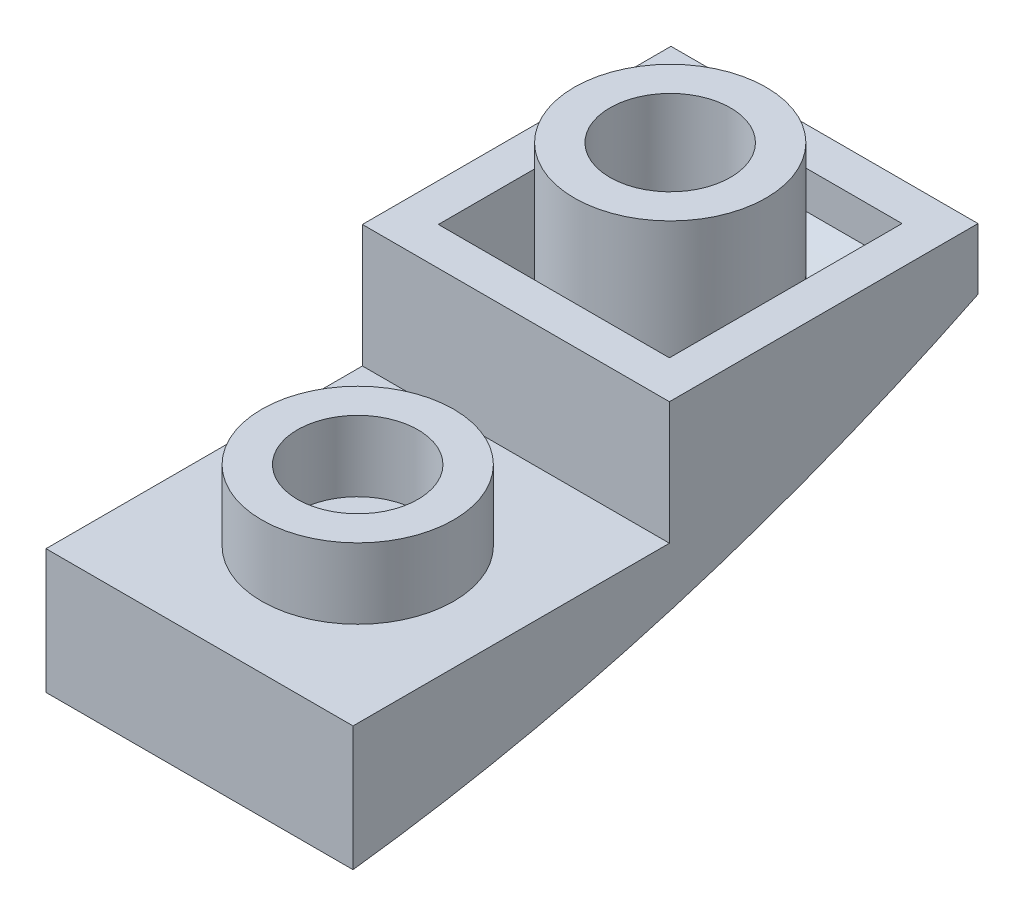
ISO-10303-21;
HEADER;
FILE_DESCRIPTION(('STEP AP214'),'2;1');
FILE_NAME('part.step','',(''),(''),'','','');
FILE_SCHEMA(('AUTOMOTIVE_DESIGN { 1 0 10303 214 1 1 1 1 }'));
ENDSEC;
DATA;
#1=APPLICATION_CONTEXT('core data for automotive mechanical design processes');
#2=APPLICATION_PROTOCOL_DEFINITION('international standard','automotive_design',2000,#1);
#3=PRODUCT_CONTEXT('',#1,'mechanical');
#4=PRODUCT('Part','Part','',(#3));
#5=PRODUCT_RELATED_PRODUCT_CATEGORY('part','',(#4));
#6=PRODUCT_DEFINITION_FORMATION('','',#4);
#7=PRODUCT_DEFINITION_CONTEXT('part definition',#1,'design');
#8=PRODUCT_DEFINITION('design','',#6,#7);
#9=PRODUCT_DEFINITION_SHAPE('','',#8);
#10=(LENGTH_UNIT() NAMED_UNIT(*) SI_UNIT(.MILLI.,.METRE.));
#11=(NAMED_UNIT(*) PLANE_ANGLE_UNIT() SI_UNIT($,.RADIAN.));
#12=(NAMED_UNIT(*) SI_UNIT($,.STERADIAN.) SOLID_ANGLE_UNIT());
#13=UNCERTAINTY_MEASURE_WITH_UNIT(LENGTH_MEASURE(1.E-05),#10,'distance_accuracy_value','');
#14=(GEOMETRIC_REPRESENTATION_CONTEXT(3) GLOBAL_UNCERTAINTY_ASSIGNED_CONTEXT((#13)) GLOBAL_UNIT_ASSIGNED_CONTEXT((#10,
#11,#12)) REPRESENTATION_CONTEXT('',''));
#15=CARTESIAN_POINT('',(0.,0.,0.));
#16=DIRECTION('',(0.,0.,1.));
#17=DIRECTION('',(1.,0.,0.));
#18=AXIS2_PLACEMENT_3D('',#15,#16,#17);
#19=CARTESIAN_POINT('',(-7.84,-43.320185519142,-22.0299823175645));
#20=DIRECTION('',(0.,1.,0.));
#21=DIRECTION('',(0.,0.,1.));
#22=AXIS2_PLACEMENT_3D('',#19,#20,#21);
#23=PLANE('',#22);
#24=DIRECTION('',(0.,0.,1.));
#25=VECTOR('',#24,1.);
#26=CARTESIAN_POINT('',(0.,-43.320185519142,-22.0299823175645));
#27=LINE('',#26,#25);
#28=CARTESIAN_POINT('',(0.,-43.320185519142,-22.0299823175645));
#29=VERTEX_POINT('',#28);
#30=CARTESIAN_POINT('',(0.,-43.320185519142,-14.1499823175645));
#31=VERTEX_POINT('',#30);
#32=EDGE_CURVE('E143',#29,#31,#27,.T.);
#33=ORIENTED_EDGE('',*,*,#32,.F.);
#34=DIRECTION('',(1.,0.,0.));
#35=VECTOR('',#34,1.);
#36=CARTESIAN_POINT('',(-7.84,-43.320185519142,-22.0299823175645));
#37=LINE('',#36,#35);
#38=CARTESIAN_POINT('',(-7.84,-43.320185519142,-22.0299823175645));
#39=VERTEX_POINT('',#38);
#40=EDGE_CURVE('E156',#39,#29,#37,.T.);
#41=ORIENTED_EDGE('',*,*,#40,.F.);
#42=DIRECTION('',(0.,0.,1.));
#43=VECTOR('',#42,1.);
#44=CARTESIAN_POINT('',(-7.84,-43.320185519142,-22.0299823175645));
#45=LINE('',#44,#43);
#46=CARTESIAN_POINT('',(-7.84,-43.320185519142,-14.1499823175645));
#47=VERTEX_POINT('',#46);
#48=EDGE_CURVE('E129',#39,#47,#45,.T.);
#49=ORIENTED_EDGE('',*,*,#48,.T.);
#50=DIRECTION('',(1.,0.,0.));
#51=VECTOR('',#50,1.);
#52=CARTESIAN_POINT('',(-7.84,-43.320185519142,-14.1499823175645));
#53=LINE('',#52,#51);
#54=EDGE_CURVE('E118',#47,#31,#53,.T.);
#55=ORIENTED_EDGE('',*,*,#54,.T.);
#56=EDGE_LOOP('',(#33,#41,#49,#55));
#57=FACE_BOUND('',#56,.T.);
#58=DIRECTION('',(1.,0.,0.));
#59=VECTOR('',#58,1.);
#60=CARTESIAN_POINT('',(-7.84,-43.320185519142,-21.0599823175645));
#61=LINE('',#60,#59);
#62=CARTESIAN_POINT('',(-6.87,-43.320185519142,-21.0599823175645));
#63=VERTEX_POINT('',#62);
#64=CARTESIAN_POINT('',(-0.97,-43.320185519142,-21.0599823175645));
#65=VERTEX_POINT('',#64);
#66=EDGE_CURVE('E207',#63,#65,#61,.T.);
#67=ORIENTED_EDGE('',*,*,#66,.T.);
#68=DIRECTION('',(0.,0.,1.));
#69=VECTOR('',#68,1.);
#70=CARTESIAN_POINT('',(-0.97,-43.320185519142,0.));
#71=LINE('',#70,#69);
#72=CARTESIAN_POINT('',(-0.97,-43.320185519142,-15.1199823175645));
#73=VERTEX_POINT('',#72);
#74=EDGE_CURVE('E227',#65,#73,#71,.T.);
#75=ORIENTED_EDGE('',*,*,#74,.T.);
#76=DIRECTION('',(1.,0.,0.));
#77=VECTOR('',#76,1.);
#78=CARTESIAN_POINT('',(-7.84,-43.320185519142,-15.1199823175645));
#79=LINE('',#78,#77);
#80=CARTESIAN_POINT('',(-6.87,-43.320185519142,-15.1199823175645));
#81=VERTEX_POINT('',#80);
#82=EDGE_CURVE('E215',#81,#73,#79,.T.);
#83=ORIENTED_EDGE('',*,*,#82,.F.);
#84=DIRECTION('',(0.,0.,1.));
#85=VECTOR('',#84,1.);
#86=CARTESIAN_POINT('',(-6.87,-43.320185519142,0.));
#87=LINE('',#86,#85);
#88=EDGE_CURVE('E51',#63,#81,#87,.T.);
#89=ORIENTED_EDGE('',*,*,#88,.F.);
#90=EDGE_LOOP('',(#67,#75,#83,#89));
#91=FACE_BOUND('',#90,.T.);
#92=ADVANCED_FACE('F36',(#57,#91),#23,.T.);
#93=CARTESIAN_POINT('',(-7.84,0.,0.));
#94=DIRECTION('',(1.,0.,0.));
#95=DIRECTION('',(0.,0.,-1.));
#96=AXIS2_PLACEMENT_3D('',#93,#94,#95);
#97=CYLINDRICAL_SURFACE('',#96,50.);
#98=CARTESIAN_POINT('',(0.,0.,0.));
#99=DIRECTION('',(1.,0.,0.));
#100=DIRECTION('',(0.,0.,-1.));
#101=AXIS2_PLACEMENT_3D('',#98,#99,#100);
#102=CIRCLE('',#101,50.);
#103=CARTESIAN_POINT('',(0.,-49.630185519142,-6.0699823175645));
#104=VERTEX_POINT('',#103);
#105=CARTESIAN_POINT('',(0.,-44.885185519142,-22.0299823175645));
#106=VERTEX_POINT('',#105);
#107=EDGE_CURVE('E136',#104,#106,#102,.T.);
#108=ORIENTED_EDGE('',*,*,#107,.F.);
#109=DIRECTION('',(1.,0.,0.));
#110=VECTOR('',#109,1.);
#111=CARTESIAN_POINT('',(-7.84,-49.630185519142,-6.0699823175645));
#112=LINE('',#111,#110);
#113=CARTESIAN_POINT('',(-7.84,-49.630185519142,-6.0699823175645));
#114=VERTEX_POINT('',#113);
#115=EDGE_CURVE('E60',#114,#104,#112,.T.);
#116=ORIENTED_EDGE('',*,*,#115,.F.);
#117=CARTESIAN_POINT('',(-7.84,0.,0.));
#118=DIRECTION('',(1.,0.,0.));
#119=DIRECTION('',(0.,0.,-1.));
#120=AXIS2_PLACEMENT_3D('',#117,#118,#119);
#121=CIRCLE('',#120,50.);
#122=CARTESIAN_POINT('',(-7.84,-44.885185519142,-22.0299823175645));
#123=VERTEX_POINT('',#122);
#124=EDGE_CURVE('E152',#114,#123,#121,.T.);
#125=ORIENTED_EDGE('',*,*,#124,.T.);
#126=DIRECTION('',(1.,0.,0.));
#127=VECTOR('',#126,1.);
#128=CARTESIAN_POINT('',(-7.84,-44.885185519142,-22.0299823175645));
#129=LINE('',#128,#127);
#130=EDGE_CURVE('E93',#123,#106,#129,.T.);
#131=ORIENTED_EDGE('',*,*,#130,.T.);
#132=EDGE_LOOP('',(#108,#116,#125,#131));
#133=FACE_BOUND('',#132,.T.);
#134=ADVANCED_FACE('F38',(#133),#97,.T.);
#135=CARTESIAN_POINT('',(-7.84,-46.450185519142,-6.0699823175645));
#136=DIRECTION('',(0.,0.,1.));
#137=DIRECTION('',(1.,0.,0.));
#138=AXIS2_PLACEMENT_3D('',#135,#136,#137);
#139=PLANE('',#138);
#140=DIRECTION('',(0.,-1.,0.));
#141=VECTOR('',#140,1.);
#142=CARTESIAN_POINT('',(0.,-46.450185519142,-6.0699823175645));
#143=LINE('',#142,#141);
#144=CARTESIAN_POINT('',(0.,-46.450185519142,-6.0699823175645));
#145=VERTEX_POINT('',#144);
#146=EDGE_CURVE('E149',#145,#104,#143,.T.);
#147=ORIENTED_EDGE('',*,*,#146,.F.);
#148=DIRECTION('',(1.,0.,0.));
#149=VECTOR('',#148,1.);
#150=CARTESIAN_POINT('',(-7.84,-46.450185519142,-6.0699823175645));
#151=LINE('',#150,#149);
#152=CARTESIAN_POINT('',(-7.84,-46.450185519142,-6.0699823175645));
#153=VERTEX_POINT('',#152);
#154=EDGE_CURVE('E117',#153,#145,#151,.T.);
#155=ORIENTED_EDGE('',*,*,#154,.F.);
#156=DIRECTION('',(0.,-1.,0.));
#157=VECTOR('',#156,1.);
#158=CARTESIAN_POINT('',(-7.84,-46.450185519142,-6.0699823175645));
#159=LINE('',#158,#157);
#160=EDGE_CURVE('E126',#153,#114,#159,.T.);
#161=ORIENTED_EDGE('',*,*,#160,.T.);
#162=ORIENTED_EDGE('',*,*,#115,.T.);
#163=EDGE_LOOP('',(#147,#155,#161,#162));
#164=FACE_BOUND('',#163,.T.);
#165=ADVANCED_FACE('F247',(#164),#139,.T.);
#166=CARTESIAN_POINT('',(-7.84,-46.450185519142,-14.1499823175645));
#167=DIRECTION('',(0.,1.,0.));
#168=DIRECTION('',(0.,0.,1.));
#169=AXIS2_PLACEMENT_3D('',#166,#167,#168);
#170=PLANE('',#169);
#171=CARTESIAN_POINT('',(-3.92,-46.450185519142,-10.1099823175645));
#172=DIRECTION('',(0.,1.,0.));
#173=DIRECTION('',(0.,0.,1.));
#174=AXIS2_PLACEMENT_3D('',#171,#172,#173);
#175=CIRCLE('',#174,2.45);
#176=CARTESIAN_POINT('',(-3.92,-46.450185519142,-7.6599823175645));
#177=VERTEX_POINT('',#176);
#178=EDGE_CURVE('E531',#177,#177,#175,.T.);
#179=ORIENTED_EDGE('',*,*,#178,.F.);
#180=EDGE_LOOP('',(#179));
#181=FACE_BOUND('',#180,.T.);
#182=DIRECTION('',(0.,0.,1.));
#183=VECTOR('',#182,1.);
#184=CARTESIAN_POINT('',(0.,-46.450185519142,-14.1499823175645));
#185=LINE('',#184,#183);
#186=CARTESIAN_POINT('',(0.,-46.450185519142,-14.1499823175645));
#187=VERTEX_POINT('',#186);
#188=EDGE_CURVE('E112',#187,#145,#185,.T.);
#189=ORIENTED_EDGE('',*,*,#188,.F.);
#190=DIRECTION('',(1.,0.,0.));
#191=VECTOR('',#190,1.);
#192=CARTESIAN_POINT('',(-7.84,-46.450185519142,-14.1499823175645));
#193=LINE('',#192,#191);
#194=CARTESIAN_POINT('',(-7.84,-46.450185519142,-14.1499823175645));
#195=VERTEX_POINT('',#194);
#196=EDGE_CURVE('E106',#195,#187,#193,.T.);
#197=ORIENTED_EDGE('',*,*,#196,.F.);
#198=DIRECTION('',(0.,0.,1.));
#199=VECTOR('',#198,1.);
#200=CARTESIAN_POINT('',(-7.84,-46.450185519142,-14.1499823175645));
#201=LINE('',#200,#199);
#202=EDGE_CURVE('E109',#195,#153,#201,.T.);
#203=ORIENTED_EDGE('',*,*,#202,.T.);
#204=ORIENTED_EDGE('',*,*,#154,.T.);
#205=EDGE_LOOP('',(#189,#197,#203,#204));
#206=FACE_BOUND('',#205,.T.);
#207=ADVANCED_FACE('F108',(#181,#206),#170,.T.);
#208=CARTESIAN_POINT('',(-7.84,-43.320185519142,-14.1499823175645));
#209=DIRECTION('',(0.,0.,1.));
#210=DIRECTION('',(1.,0.,0.));
#211=AXIS2_PLACEMENT_3D('',#208,#209,#210);
#212=PLANE('',#211);
#213=DIRECTION('',(0.,-1.,0.));
#214=VECTOR('',#213,1.);
#215=CARTESIAN_POINT('',(0.,-43.320185519142,-14.1499823175645));
#216=LINE('',#215,#214);
#217=EDGE_CURVE('E146',#31,#187,#216,.T.);
#218=ORIENTED_EDGE('',*,*,#217,.F.);
#219=ORIENTED_EDGE('',*,*,#54,.F.);
#220=DIRECTION('',(0.,-1.,0.));
#221=VECTOR('',#220,1.);
#222=CARTESIAN_POINT('',(-7.84,-43.320185519142,-14.1499823175645));
#223=LINE('',#222,#221);
#224=EDGE_CURVE('E124',#47,#195,#223,.T.);
#225=ORIENTED_EDGE('',*,*,#224,.T.);
#226=ORIENTED_EDGE('',*,*,#196,.T.);
#227=EDGE_LOOP('',(#218,#219,#225,#226));
#228=FACE_BOUND('',#227,.T.);
#229=ADVANCED_FACE('F128',(#228),#212,.T.);
#230=CARTESIAN_POINT('',(-7.84,-44.885185519142,-22.0299823175645));
#231=DIRECTION('',(0.,0.,-1.));
#232=DIRECTION('',(-1.,0.,0.));
#233=AXIS2_PLACEMENT_3D('',#230,#231,#232);
#234=PLANE('',#233);
#235=DIRECTION('',(0.,1.,0.));
#236=VECTOR('',#235,1.);
#237=CARTESIAN_POINT('',(0.,-44.885185519142,-22.0299823175645));
#238=LINE('',#237,#236);
#239=EDGE_CURVE('E139',#106,#29,#238,.T.);
#240=ORIENTED_EDGE('',*,*,#239,.F.);
#241=ORIENTED_EDGE('',*,*,#130,.F.);
#242=DIRECTION('',(0.,1.,0.));
#243=VECTOR('',#242,1.);
#244=CARTESIAN_POINT('',(-7.84,-44.885185519142,-22.0299823175645));
#245=LINE('',#244,#243);
#246=EDGE_CURVE('E131',#123,#39,#245,.T.);
#247=ORIENTED_EDGE('',*,*,#246,.T.);
#248=ORIENTED_EDGE('',*,*,#40,.T.);
#249=EDGE_LOOP('',(#240,#241,#247,#248));
#250=FACE_BOUND('',#249,.T.);
#251=ADVANCED_FACE('F243',(#250),#234,.T.);
#252=CARTESIAN_POINT('',(-7.84,0.,0.));
#253=DIRECTION('',(1.,0.,0.));
#254=DIRECTION('',(0.,0.,-1.));
#255=AXIS2_PLACEMENT_3D('',#252,#253,#254);
#256=PLANE('',#255);
#257=ORIENTED_EDGE('',*,*,#124,.F.);
#258=ORIENTED_EDGE('',*,*,#160,.F.);
#259=ORIENTED_EDGE('',*,*,#202,.F.);
#260=ORIENTED_EDGE('',*,*,#224,.F.);
#261=ORIENTED_EDGE('',*,*,#48,.F.);
#262=ORIENTED_EDGE('',*,*,#246,.F.);
#263=EDGE_LOOP('',(#257,#258,#259,#260,#261,#262));
#264=FACE_BOUND('',#263,.T.);
#265=ADVANCED_FACE('F122',(#264),#256,.F.);
#266=CARTESIAN_POINT('',(0.,0.,0.));
#267=DIRECTION('',(1.,0.,0.));
#268=DIRECTION('',(0.,0.,-1.));
#269=AXIS2_PLACEMENT_3D('',#266,#267,#268);
#270=PLANE('',#269);
#271=ORIENTED_EDGE('',*,*,#107,.T.);
#272=ORIENTED_EDGE('',*,*,#239,.T.);
#273=ORIENTED_EDGE('',*,*,#32,.T.);
#274=ORIENTED_EDGE('',*,*,#217,.T.);
#275=ORIENTED_EDGE('',*,*,#188,.T.);
#276=ORIENTED_EDGE('',*,*,#146,.T.);
#277=EDGE_LOOP('',(#271,#272,#273,#274,#275,#276));
#278=FACE_BOUND('',#277,.T.);
#279=ADVANCED_FACE('F246',(#278),#270,.T.);
#280=CARTESIAN_POINT('',(-0.97,0.,0.));
#281=DIRECTION('',(1.,0.,0.));
#282=DIRECTION('',(0.,0.,-1.));
#283=AXIS2_PLACEMENT_3D('',#280,#281,#282);
#284=PLANE('',#283);
#285=DIRECTION('',(0.,-1.,0.));
#286=VECTOR('',#285,1.);
#287=CARTESIAN_POINT('',(-0.97,0.,-15.1199823175645));
#288=LINE('',#287,#286);
#289=CARTESIAN_POINT('',(-0.97,-46.6404013138452,-15.1199823175645));
#290=VERTEX_POINT('',#289);
#291=EDGE_CURVE('E221',#73,#290,#288,.T.);
#292=ORIENTED_EDGE('',*,*,#291,.F.);
#293=ORIENTED_EDGE('',*,*,#74,.F.);
#294=DIRECTION('',(0.,1.,0.));
#295=VECTOR('',#294,1.);
#296=CARTESIAN_POINT('',(-0.97,0.,-21.0599823175645));
#297=LINE('',#296,#295);
#298=CARTESIAN_POINT('',(-0.97,-44.2766083252079,-21.0599823175645));
#299=VERTEX_POINT('',#298);
#300=EDGE_CURVE('E192',#299,#65,#297,.T.);
#301=ORIENTED_EDGE('',*,*,#300,.F.);
#302=CARTESIAN_POINT('',(-0.97,0.,0.));
#303=DIRECTION('',(1.,0.,0.));
#304=DIRECTION('',(0.,0.,-1.));
#305=AXIS2_PLACEMENT_3D('',#302,#303,#304);
#306=CIRCLE('',#305,49.03);
#307=EDGE_CURVE('E193',#290,#299,#306,.T.);
#308=ORIENTED_EDGE('',*,*,#307,.F.);
#309=EDGE_LOOP('',(#292,#293,#301,#308));
#310=FACE_BOUND('',#309,.T.);
#311=ADVANCED_FACE('F336',(#310),#284,.F.);
#312=CARTESIAN_POINT('',(-7.84,0.,0.));
#313=DIRECTION('',(1.,0.,0.));
#314=DIRECTION('',(0.,0.,-1.));
#315=AXIS2_PLACEMENT_3D('',#312,#313,#314);
#316=CYLINDRICAL_SURFACE('',#315,49.03);
#317=CARTESIAN_POINT('',(-3.92,-46.4686114824434,-15.6399823175645));
#318=CARTESIAN_POINT('',(-3.78793012184935,-46.4686097458206,-15.6399890439709));
#319=CARTESIAN_POINT('',(-3.65575647217031,-46.4650061011459,-15.65070710071));
#320=CARTESIAN_POINT('',(-3.39513144873376,-46.4506659567495,-15.6932155357453));
#321=CARTESIAN_POINT('',(-3.26668505116116,-46.4399203414416,-15.7250328437522));
#322=CARTESIAN_POINT('',(-3.01742799039696,-46.411569374732,-15.8085121128509));
#323=CARTESIAN_POINT('',(-2.89660648318951,-46.3939740326378,-15.8601451162884));
#324=CARTESIAN_POINT('',(-2.66563665333225,-46.3523421335326,-15.981406944121));
#325=CARTESIAN_POINT('',(-2.55548629364526,-46.3283068091749,-16.0510323245711));
#326=CARTESIAN_POINT('',(-2.34642737949569,-46.2738038074009,-16.2074969528653));
#327=CARTESIAN_POINT('',(-2.24778498952123,-46.2432180540684,-16.2946501037191));
#328=CARTESIAN_POINT('',(-2.06650956523098,-46.1766092633735,-16.4824626218562));
#329=CARTESIAN_POINT('',(-1.98388009245983,-46.1405850195611,-16.5831249854108));
#330=CARTESIAN_POINT('',(-1.8325288872738,-46.0619747275058,-16.8002781505073));
#331=CARTESIAN_POINT('',(-1.76470341506555,-46.0191514136788,-16.9173072283813));
#332=CARTESIAN_POINT('',(-1.64957308803988,-45.9293665497608,-17.1595712133401));
#333=CARTESIAN_POINT('',(-1.60227386942889,-45.8824038673137,-17.2848083633886));
#334=CARTESIAN_POINT('',(-1.52660253365797,-45.7824926585864,-17.5477971657542));
#335=CARTESIAN_POINT('',(-1.49952651227691,-45.7293541945631,-17.685849817443));
#336=CARTESIAN_POINT('',(-1.46926439676582,-45.6209167200115,-17.9637168537708));
#337=CARTESIAN_POINT('',(-1.46608503600493,-45.5656171049467,-18.1035317238355));
#338=CARTESIAN_POINT('',(-1.48384426766833,-45.4514718745921,-18.3882915650631));
#339=CARTESIAN_POINT('',(-1.50598812203153,-45.3925865181727,-18.5331465964097));
#340=CARTESIAN_POINT('',(-1.57578298597003,-45.2756676834164,-18.8169709408147));
#341=CARTESIAN_POINT('',(-1.62343916496053,-45.2176343801754,-18.9559390548805));
#342=CARTESIAN_POINT('',(-1.74414181423609,-45.1035222138011,-19.225892690886));
#343=CARTESIAN_POINT('',(-1.81752207548778,-45.0474802694379,-19.3567452633338));
#344=CARTESIAN_POINT('',(-1.98812079840642,-44.9403345308019,-19.604219656365));
#345=CARTESIAN_POINT('',(-2.08533597266702,-44.8892300568875,-19.7208434361211));
#346=CARTESIAN_POINT('',(-2.29688751184831,-44.7963111178827,-19.9309828267208));
#347=CARTESIAN_POINT('',(-2.41032344350158,-44.7541946836954,-20.0252684191505));
#348=CARTESIAN_POINT('',(-2.65431371384398,-44.678796022317,-20.1929335965037));
#349=CARTESIAN_POINT('',(-2.78485677307532,-44.6455080175186,-20.2663268563578));
#350=CARTESIAN_POINT('',(-3.0472075034513,-44.5921919651223,-20.3833537210891));
#351=CARTESIAN_POINT('',(-3.17792899033321,-44.5712659879681,-20.4290124176829));
#352=CARTESIAN_POINT('',(-3.44635443299553,-44.5396996699489,-20.4977441070739));
#353=CARTESIAN_POINT('',(-3.58405413962597,-44.5290531471149,-20.520830674647));
#354=CARTESIAN_POINT('',(-3.85071360352618,-44.5191242327898,-20.5423609743118));
#355=CARTESIAN_POINT('',(-3.97949946032329,-44.5190068375307,-20.5426153922119));
#356=CARTESIAN_POINT('',(-4.23518179747117,-44.528051367823,-20.5230031354696));
#357=CARTESIAN_POINT('',(-4.36207858446745,-44.537211770305,-20.5031397634203));
#358=CARTESIAN_POINT('',(-4.60763085817048,-44.5640133151155,-20.4448185449616));
#359=CARTESIAN_POINT('',(-4.72640495132205,-44.5814676429411,-20.4067701967546));
#360=CARTESIAN_POINT('',(-4.95567129225842,-44.6239237057538,-20.3137621468375));
#361=CARTESIAN_POINT('',(-5.06616230589592,-44.648926562664,-20.258799931229));
#362=CARTESIAN_POINT('',(-5.28112812320348,-44.7066546195617,-20.1310963201581));
#363=CARTESIAN_POINT('',(-5.38511860862608,-44.7396731866612,-20.0576743841186));
#364=CARTESIAN_POINT('',(-5.57940231464429,-44.8114232025114,-19.896858969392));
#365=CARTESIAN_POINT('',(-5.66969100963508,-44.8501565305124,-19.809460893975));
#366=CARTESIAN_POINT('',(-5.84187390203068,-44.9353634360945,-19.6154559738905));
#367=CARTESIAN_POINT('',(-5.92246908391154,-44.9822114835006,-19.5078609280737));
#368=CARTESIAN_POINT('',(-6.06453453693933,-45.0794249936196,-19.2821537028778));
#369=CARTESIAN_POINT('',(-6.12599763781096,-45.1297917664337,-19.1640376017214));
#370=CARTESIAN_POINT('',(-6.23292344911244,-45.2366411847016,-18.9105142696247));
#371=CARTESIAN_POINT('',(-6.27673223388323,-45.2932921906905,-18.7744785450884));
#372=CARTESIAN_POINT('',(-6.34012024751547,-45.4072646047417,-18.4971272293612));
#373=CARTESIAN_POINT('',(-6.35969272567961,-45.4645861951003,-18.3558101784143));
#374=CARTESIAN_POINT('',(-6.37434942613532,-45.5806293594625,-18.0657817798217));
#375=CARTESIAN_POINT('',(-6.36841233708546,-45.6393139297917,-17.9170023608619));
#376=CARTESIAN_POINT('',(-6.32947939642826,-45.7540445572368,-17.6219568875695));
#377=CARTESIAN_POINT('',(-6.2964833042573,-45.8100905908905,-17.4756908555935));
#378=CARTESIAN_POINT('',(-6.20432585986975,-45.917289645555,-17.1920364770989));
#379=CARTESIAN_POINT('',(-6.14550273672492,-45.9684958462904,-17.0545588589998));
#380=CARTESIAN_POINT('',(-6.00276827178843,-46.0653692790056,-16.7911390966786));
#381=CARTESIAN_POINT('',(-5.91886517609546,-46.1110383246321,-16.6651931786763));
#382=CARTESIAN_POINT('',(-5.73289554596071,-46.1933115908786,-16.4357225901275));
#383=CARTESIAN_POINT('',(-5.63200446459476,-46.2302643467502,-16.3313711613554));
#384=CARTESIAN_POINT('',(-5.41194785196163,-46.2970021718265,-16.1412103590789));
#385=CARTESIAN_POINT('',(-5.29278446920477,-46.3267880826732,-16.0553988084559));
#386=CARTESIAN_POINT('',(-5.04756702014449,-46.3767431932261,-15.910503484547));
#387=CARTESIAN_POINT('',(-4.92238879612431,-46.3973915382596,-15.8500994939691));
#388=CARTESIAN_POINT('',(-4.66283700608917,-46.431060767675,-15.75119862291));
#389=CARTESIAN_POINT('',(-4.52847935175193,-46.4440944945141,-15.7126648602803));
#390=CARTESIAN_POINT('',(-4.31414990458189,-46.4582981071643,-15.6705988425715));
#391=CARTESIAN_POINT('',(-4.23582304262373,-46.4621613875718,-15.6591355012686));
#392=CARTESIAN_POINT('',(-4.07834321170273,-46.4673185684873,-15.6438253032962));
#393=CARTESIAN_POINT('',(-3.99919026037679,-46.4686125237377,-15.6399782843521));
#394=CARTESIAN_POINT('',(-3.92,-46.4686114824434,-15.6399823175645));
#395=B_SPLINE_CURVE_WITH_KNOTS('',3,(#317,#318,#319,#320,#321,#322,#323,#324,#325,#326,#327,
#328,#329,#330,#331,#332,#333,#334,#335,#336,#337,#338,#339,#340,#341,#342,#343,#344,#345,#346,
#347,#348,#349,#350,#351,#352,#353,#354,#355,#356,#357,#358,#359,#360,#361,#362,#363,#364,#365,
#366,#367,#368,#369,#370,#371,#372,#373,#374,#375,#376,#377,#378,#379,#380,#381,#382,#383,#384,
#385,#386,#387,#388,#389,#390,#391,#392,#393,#394),.UNSPECIFIED.,.T.,.F.,(4,2,2,2,2,2,2,2,2,2,2,
2,2,2,2,2,2,2,2,2,2,2,2,2,2,2,2,2,2,2,2,2,2,2,2,2,2,2,4),(0.,0.395912322200955,
0.792330936202807,1.18817243650357,1.58393822430024,1.98755015085772,2.39125174478852,
2.81503451962393,3.23893358544303,3.68809748665836,4.1373879441763,4.6089850853992,
5.08067781981912,5.55873267974914,6.03672164149962,6.49444904933009,6.95187616234211,
7.3697350719325,7.78734252821314,8.1718001006179,8.5561945696124,8.93231398057894,
9.30848932098079,9.70135212992641,10.0943444175838,10.5196224297355,10.9450596351904,
11.4042106215775,11.8634894695518,12.3413238945166,12.819162567636,13.290921925193,
13.7625263422607,14.2095358005104,14.6564927383364,15.0759336339128,15.4946650626455,
15.73206263082,15.9694551409101),.UNSPECIFIED.);
#396=CARTESIAN_POINT('',(-3.92,-46.4686114824434,-15.6399823175645));
#397=VERTEX_POINT('',#396);
#398=EDGE_CURVE('E179',#397,#397,#395,.T.);
#399=ORIENTED_EDGE('',*,*,#398,.F.);
#400=EDGE_LOOP('',(#399));
#401=FACE_BOUND('',#400,.T.);
#402=ORIENTED_EDGE('',*,*,#307,.T.);
#403=DIRECTION('',(1.,0.,0.));
#404=VECTOR('',#403,1.);
#405=CARTESIAN_POINT('',(-6.87,-44.2766083252079,-21.0599823175645));
#406=LINE('',#405,#404);
#407=CARTESIAN_POINT('',(-6.87,-44.2766083252079,-21.0599823175645));
#408=VERTEX_POINT('',#407);
#409=EDGE_CURVE('E204',#408,#299,#406,.T.);
#410=ORIENTED_EDGE('',*,*,#409,.F.);
#411=CARTESIAN_POINT('',(-6.87,0.,0.));
#412=DIRECTION('',(1.,0.,0.));
#413=DIRECTION('',(0.,0.,-1.));
#414=AXIS2_PLACEMENT_3D('',#411,#412,#413);
#415=CIRCLE('',#414,49.03);
#416=CARTESIAN_POINT('',(-6.87,-46.6404013138452,-15.1199823175645));
#417=VERTEX_POINT('',#416);
#418=EDGE_CURVE('E199',#417,#408,#415,.T.);
#419=ORIENTED_EDGE('',*,*,#418,.F.);
#420=DIRECTION('',(1.,0.,0.));
#421=VECTOR('',#420,1.);
#422=CARTESIAN_POINT('',(-7.84,-46.6404013138452,-15.1199823175645));
#423=LINE('',#422,#421);
#424=EDGE_CURVE('E197',#290,#417,#423,.F.);
#425=ORIENTED_EDGE('',*,*,#424,.F.);
#426=EDGE_LOOP('',(#402,#410,#419,#425));
#427=FACE_BOUND('',#426,.T.);
#428=ADVANCED_FACE('F164',(#401,#427),#316,.F.);
#429=CARTESIAN_POINT('',(-7.84,-43.320185519142,-15.1199823175645));
#430=DIRECTION('',(0.,0.,1.));
#431=DIRECTION('',(1.,0.,0.));
#432=AXIS2_PLACEMENT_3D('',#429,#430,#431);
#433=PLANE('',#432);
#434=ORIENTED_EDGE('',*,*,#424,.T.);
#435=DIRECTION('',(0.,-1.,0.));
#436=VECTOR('',#435,1.);
#437=CARTESIAN_POINT('',(-6.87,0.,-15.1199823175645));
#438=LINE('',#437,#436);
#439=EDGE_CURVE('E224',#81,#417,#438,.T.);
#440=ORIENTED_EDGE('',*,*,#439,.F.);
#441=ORIENTED_EDGE('',*,*,#82,.T.);
#442=ORIENTED_EDGE('',*,*,#291,.T.);
#443=EDGE_LOOP('',(#434,#440,#441,#442));
#444=FACE_BOUND('',#443,.T.);
#445=ADVANCED_FACE('F377',(#444),#433,.F.);
#446=CARTESIAN_POINT('',(-7.84,-44.885185519142,-21.0599823175645));
#447=DIRECTION('',(0.,0.,-1.));
#448=DIRECTION('',(-1.,0.,0.));
#449=AXIS2_PLACEMENT_3D('',#446,#447,#448);
#450=PLANE('',#449);
#451=ORIENTED_EDGE('',*,*,#300,.T.);
#452=ORIENTED_EDGE('',*,*,#66,.F.);
#453=DIRECTION('',(0.,1.,0.));
#454=VECTOR('',#453,1.);
#455=CARTESIAN_POINT('',(-6.87,0.,-21.0599823175645));
#456=LINE('',#455,#454);
#457=EDGE_CURVE('E202',#408,#63,#456,.T.);
#458=ORIENTED_EDGE('',*,*,#457,.F.);
#459=ORIENTED_EDGE('',*,*,#409,.T.);
#460=EDGE_LOOP('',(#451,#452,#458,#459));
#461=FACE_BOUND('',#460,.T.);
#462=ADVANCED_FACE('F457',(#461),#450,.F.);
#463=CARTESIAN_POINT('',(-6.87,0.,0.));
#464=DIRECTION('',(1.,0.,0.));
#465=DIRECTION('',(0.,0.,-1.));
#466=AXIS2_PLACEMENT_3D('',#463,#464,#465);
#467=PLANE('',#466);
#468=ORIENTED_EDGE('',*,*,#418,.T.);
#469=ORIENTED_EDGE('',*,*,#457,.T.);
#470=ORIENTED_EDGE('',*,*,#88,.T.);
#471=ORIENTED_EDGE('',*,*,#439,.T.);
#472=EDGE_LOOP('',(#468,#469,#470,#471));
#473=FACE_BOUND('',#472,.T.);
#474=ADVANCED_FACE('F362',(#473),#467,.T.);
#475=CARTESIAN_POINT('',(-3.92,-49.631185519142,-18.0899823175645));
#476=DIRECTION('',(0.,1.,0.));
#477=DIRECTION('',(0.,0.,1.));
#478=AXIS2_PLACEMENT_3D('',#475,#476,#477);
#479=CYLINDRICAL_SURFACE('',#478,2.45);
#480=CARTESIAN_POINT('',(-3.92,-41.520185519142,-18.0899823175645));
#481=DIRECTION('',(0.,1.,0.));
#482=DIRECTION('',(0.,0.,1.));
#483=AXIS2_PLACEMENT_3D('',#480,#481,#482);
#484=CIRCLE('',#483,2.45);
#485=CARTESIAN_POINT('',(-3.92,-41.520185519142,-15.6399823175645));
#486=VERTEX_POINT('',#485);
#487=EDGE_CURVE('E524',#486,#486,#484,.T.);
#488=ORIENTED_EDGE('',*,*,#487,.F.);
#489=EDGE_LOOP('',(#488));
#490=FACE_BOUND('',#489,.T.);
#491=ORIENTED_EDGE('',*,*,#398,.T.);
#492=EDGE_LOOP('',(#491));
#493=FACE_BOUND('',#492,.T.);
#494=ADVANCED_FACE('F173',(#490,#493),#479,.T.);
#495=CARTESIAN_POINT('',(-3.92,-49.631185519142,-18.0899823175645));
#496=DIRECTION('',(0.,1.,0.));
#497=DIRECTION('',(0.,0.,1.));
#498=AXIS2_PLACEMENT_3D('',#495,#496,#497);
#499=CYLINDRICAL_SURFACE('',#498,1.54);
#500=CARTESIAN_POINT('',(-3.92,-41.520185519142,-18.0899823175645));
#501=DIRECTION('',(0.,1.,0.));
#502=DIRECTION('',(0.,0.,1.));
#503=AXIS2_PLACEMENT_3D('',#500,#501,#502);
#504=CIRCLE('',#503,1.54);
#505=CARTESIAN_POINT('',(-3.92,-41.520185519142,-16.5499823175645));
#506=VERTEX_POINT('',#505);
#507=EDGE_CURVE('E186',#506,#506,#504,.T.);
#508=ORIENTED_EDGE('',*,*,#507,.T.);
#509=EDGE_LOOP('',(#508));
#510=FACE_BOUND('',#509,.T.);
#511=CARTESIAN_POINT('',(-3.92,-46.1523453931466,-16.5499823175645));
#512=CARTESIAN_POINT('',(-4.00265658618481,-46.1523440606546,-16.5499866181094));
#513=CARTESIAN_POINT('',(-4.08537938566165,-46.1499502249647,-16.5566663573778));
#514=CARTESIAN_POINT('',(-4.24848550067391,-46.1404399998,-16.5831506646262));
#515=CARTESIAN_POINT('',(-4.32886563090629,-46.1333174673482,-16.602972305002));
#516=CARTESIAN_POINT('',(-4.48482535924032,-46.1145775840233,-16.6549509406092));
#517=CARTESIAN_POINT('',(-4.56041261388604,-46.1029676236716,-16.6870876529241));
#518=CARTESIAN_POINT('',(-4.70492853381876,-46.0755915780129,-16.762528540768));
#519=CARTESIAN_POINT('',(-4.77385836275743,-46.0598262208308,-16.8058307598043));
#520=CARTESIAN_POINT('',(-4.90496423113328,-46.024155406278,-16.9032767443337));
#521=CARTESIAN_POINT('',(-4.96694640350392,-46.0041623572935,-16.9576487962539));
#522=CARTESIAN_POINT('',(-5.08093286238447,-45.9607960265032,-17.0748361184576));
#523=CARTESIAN_POINT('',(-5.13293469178494,-45.9374219147746,-17.1376534614721));
#524=CARTESIAN_POINT('',(-5.22860152252676,-45.8864747954225,-17.2736180547202));
#525=CARTESIAN_POINT('',(-5.27163854162327,-45.8587401699853,-17.3471463276676));
#526=CARTESIAN_POINT('',(-5.34479579603791,-45.800829930652,-17.4994720013529));
#527=CARTESIAN_POINT('',(-5.37491225181501,-45.7706536055707,-17.578270936091));
#528=CARTESIAN_POINT('',(-5.42328295311539,-45.7066409669505,-17.7440761670365));
#529=CARTESIAN_POINT('',(-5.44068563194482,-45.6726937337307,-17.8312883822246));
#530=CARTESIAN_POINT('',(-5.46030227898088,-45.6037094132006,-18.0069848541221));
#531=CARTESIAN_POINT('',(-5.46251207971466,-45.5686720295046,-18.0954694531825));
#532=CARTESIAN_POINT('',(-5.45156285268651,-45.4967815965628,-18.2754911342762));
#533=CARTESIAN_POINT('',(-5.43769408933485,-45.4599189939775,-18.3669820187234));
#534=CARTESIAN_POINT('',(-5.39372239890798,-45.3870376728844,-18.5463497784953));
#535=CARTESIAN_POINT('',(-5.36361693706224,-45.3510190870556,-18.6342260872295));
#536=CARTESIAN_POINT('',(-5.28750275739535,-45.2807606023153,-18.8043116868316));
#537=CARTESIAN_POINT('',(-5.24140153220838,-45.2465324126585,-18.8864846013767));
#538=CARTESIAN_POINT('',(-5.13422404148489,-45.1813425943839,-19.041908743309));
#539=CARTESIAN_POINT('',(-5.07315067860645,-45.1503803342603,-19.1151616958998));
#540=CARTESIAN_POINT('',(-4.94056961584797,-45.094393118175,-19.2468569516009));
#541=CARTESIAN_POINT('',(-4.86967797612682,-45.0691592522173,-19.3058289663151));
#542=CARTESIAN_POINT('',(-4.71732028985833,-45.0240721527784,-19.4107470058366));
#543=CARTESIAN_POINT('',(-4.63586060796653,-45.0042157027674,-19.4567008183119));
#544=CARTESIAN_POINT('',(-4.47184555938296,-44.9723278893222,-19.5302869243312));
#545=CARTESIAN_POINT('',(-4.38992205349121,-44.9597901986592,-19.5591083042566));
#546=CARTESIAN_POINT('',(-4.22173554439488,-44.9408340619904,-19.6026250279828));
#547=CARTESIAN_POINT('',(-4.13547483206766,-44.9344124205506,-19.6173277483506));
#548=CARTESIAN_POINT('',(-3.96766244520894,-44.9282738844848,-19.6313819244403));
#549=CARTESIAN_POINT('',(-3.88621021742351,-44.9281141338496,-19.6317473500454));
#550=CARTESIAN_POINT('',(-3.72445544750101,-44.9333906427946,-19.6196673927208));
#551=CARTESIAN_POINT('',(-3.6441527280452,-44.9388260296498,-19.6072240076987));
#552=CARTESIAN_POINT('',(-3.48852987361308,-44.9548640339716,-19.5704237928602));
#553=CARTESIAN_POINT('',(-3.41314369513393,-44.9653654915933,-19.5463001622697));
#554=CARTESIAN_POINT('',(-3.26762010390231,-44.991016967276,-19.4871836038792));
#555=CARTESIAN_POINT('',(-3.19748337131698,-45.0061675864332,-19.4521892705846));
#556=CARTESIAN_POINT('',(-3.06144218432985,-45.0411751066777,-19.3709955055796));
#557=CARTESIAN_POINT('',(-2.9958075491136,-45.0611918105086,-19.3244139802395));
#558=CARTESIAN_POINT('',(-2.87324236388512,-45.1048234946307,-19.2223535106108));
#559=CARTESIAN_POINT('',(-2.81631442680128,-45.1284395508788,-19.1668719055537));
#560=CARTESIAN_POINT('',(-2.70828311378424,-45.1803560981948,-19.0441873527648));
#561=CARTESIAN_POINT('',(-2.6579253937992,-45.2088741568547,-18.9764201312301));
#562=CARTESIAN_POINT('',(-2.56924762095053,-45.2682448461121,-18.8343526316358));
#563=CARTESIAN_POINT('',(-2.53093179780621,-45.2990982923039,-18.7600500697389));
#564=CARTESIAN_POINT('',(-2.46451095012547,-45.364657000922,-18.6009872987969));
#565=CARTESIAN_POINT('',(-2.43739397979127,-45.3994772670525,-18.515861020487));
#566=CARTESIAN_POINT('',(-2.39824023400188,-45.4698065856907,-18.3424738861913));
#567=CARTESIAN_POINT('',(-2.38620776331201,-45.505315831883,-18.2542121428028));
#568=CARTESIAN_POINT('',(-2.37730714379206,-45.5776355307723,-18.0729070359643));
#569=CARTESIAN_POINT('',(-2.38112962684763,-45.6144344786416,-17.9798241756351));
#570=CARTESIAN_POINT('',(-2.4055858033983,-45.6867174183395,-17.7953524456594));
#571=CARTESIAN_POINT('',(-2.42622053137577,-45.7222013291114,-17.7039636806071));
#572=CARTESIAN_POINT('',(-2.48391912645758,-45.790674624034,-17.5260964241757));
#573=CARTESIAN_POINT('',(-2.52089898206091,-45.8236757671003,-17.4395953424828));
#574=CARTESIAN_POINT('',(-2.6106323920816,-45.8864021527635,-17.2738776605832));
#575=CARTESIAN_POINT('',(-2.66338142898084,-45.9161283302315,-17.1946589826173));
#576=CARTESIAN_POINT('',(-2.78056846849896,-45.9700304714355,-17.0500111663051));
#577=CARTESIAN_POINT('',(-2.84432147636616,-45.9944047403279,-16.9841017693711));
#578=CARTESIAN_POINT('',(-2.98347397833901,-46.0385643887664,-16.8640324965265));
#579=CARTESIAN_POINT('',(-3.05887182995533,-46.0583504144951,-16.8098709661818));
#580=CARTESIAN_POINT('',(-3.21385391595365,-46.0915331697695,-16.7186626223481));
#581=CARTESIAN_POINT('',(-3.29284886940275,-46.1052612279379,-16.6807331867344));
#582=CARTESIAN_POINT('',(-3.45668405285945,-46.1276465171429,-16.618731207922));
#583=CARTESIAN_POINT('',(-3.54151363507552,-46.1363127249454,-16.5946341355067));
#584=CARTESIAN_POINT('',(-3.67591083006815,-46.1456446971195,-16.5686590289344));
#585=CARTESIAN_POINT('',(-3.72442202639997,-46.1481541583614,-16.5616663536));
#586=CARTESIAN_POINT('',(-3.82194772116938,-46.1515048824559,-16.5523267756446));
#587=CARTESIAN_POINT('',(-3.87096220800529,-46.1523461836761,-16.549979766174));
#588=CARTESIAN_POINT('',(-3.92,-46.1523453931466,-16.5499823175645));
#589=B_SPLINE_CURVE_WITH_KNOTS('',3,(#511,#512,#513,#514,#515,#516,#517,#518,#519,#520,#521,
#522,#523,#524,#525,#526,#527,#528,#529,#530,#531,#532,#533,#534,#535,#536,#537,#538,#539,#540,
#541,#542,#543,#544,#545,#546,#547,#548,#549,#550,#551,#552,#553,#554,#555,#556,#557,#558,#559,
#560,#561,#562,#563,#564,#565,#566,#567,#568,#569,#570,#571,#572,#573,#574,#575,#576,#577,#578,
#579,#580,#581,#582,#583,#584,#585,#586,#587,#588),.UNSPECIFIED.,.T.,.F.,(4,2,2,2,2,2,2,2,2,2,2,
2,2,2,2,2,2,2,2,2,2,2,2,2,2,2,2,2,2,2,2,2,2,2,2,2,2,2,4),(0.,0.247784646940981,
0.495891818609064,0.743592102074119,0.991249011345742,1.24465351075447,1.49812031725201,
1.76574620351611,2.03345032278392,2.31775796739206,2.6021435957189,2.89957614567731,
3.19705514236782,3.49628402531878,3.79545494238473,4.08073655560413,4.36584714730909,
4.62769174903446,4.88939947042233,5.13256251004731,5.37568762705105,5.61414721489411,
5.8526376464881,6.10038200351081,6.34820056471243,6.61440811017502,6.88070905686969,
7.16709456435762,7.45356178101729,7.75263544213349,8.05172750708552,8.34929984341937,
8.64678701348624,8.92995236736254,9.213077817566,9.47782826017606,9.7421077533182,
9.88911468904522,10.0361182435957),.UNSPECIFIED.);
#590=CARTESIAN_POINT('',(-3.92,-46.1523453931466,-16.5499823175645));
#591=VERTEX_POINT('',#590);
#592=EDGE_CURVE('E44',#591,#591,#589,.T.);
#593=ORIENTED_EDGE('',*,*,#592,.T.);
#594=EDGE_LOOP('',(#593));
#595=FACE_BOUND('',#594,.T.);
#596=ADVANCED_FACE('F168',(#510,#595),#499,.F.);
#597=CARTESIAN_POINT('',(-3.92,-41.520185519142,-18.0899823175645));
#598=DIRECTION('',(0.,1.,0.));
#599=DIRECTION('',(0.,0.,1.));
#600=AXIS2_PLACEMENT_3D('',#597,#598,#599);
#601=PLANE('',#600);
#602=ORIENTED_EDGE('',*,*,#507,.F.);
#603=EDGE_LOOP('',(#602));
#604=FACE_BOUND('',#603,.T.);
#605=ORIENTED_EDGE('',*,*,#487,.T.);
#606=EDGE_LOOP('',(#605));
#607=FACE_BOUND('',#606,.T.);
#608=ADVANCED_FACE('F172',(#604,#607),#601,.T.);
#609=ORIENTED_EDGE('',*,*,#592,.F.);
#610=EDGE_LOOP('',(#609));
#611=FACE_BOUND('',#610,.T.);
#612=ADVANCED_FACE('F285',(#611),#316,.F.);
#613=CARTESIAN_POINT('',(-3.92,-44.650185519142,-10.1099823175645));
#614=DIRECTION('',(0.,1.,0.));
#615=DIRECTION('',(0.,0.,1.));
#616=AXIS2_PLACEMENT_3D('',#613,#614,#615);
#617=PLANE('',#616);
#618=CARTESIAN_POINT('',(-3.92,-44.650185519142,-10.1099823175645));
#619=DIRECTION('',(0.,1.,0.));
#620=DIRECTION('',(0.,0.,1.));
#621=AXIS2_PLACEMENT_3D('',#618,#619,#620);
#622=CIRCLE('',#621,2.45);
#623=CARTESIAN_POINT('',(-3.92,-44.650185519142,-7.6599823175645));
#624=VERTEX_POINT('',#623);
#625=EDGE_CURVE('E187',#624,#624,#622,.T.);
#626=ORIENTED_EDGE('',*,*,#625,.T.);
#627=EDGE_LOOP('',(#626));
#628=FACE_BOUND('',#627,.T.);
#629=CARTESIAN_POINT('',(-3.92,-44.650185519142,-10.1099823175645));
#630=DIRECTION('',(0.,1.,0.));
#631=DIRECTION('',(0.,0.,1.));
#632=AXIS2_PLACEMENT_3D('',#629,#630,#631);
#633=CIRCLE('',#632,1.54);
#634=CARTESIAN_POINT('',(-3.92,-44.650185519142,-8.5699823175645));
#635=VERTEX_POINT('',#634);
#636=EDGE_CURVE('E534',#635,#635,#633,.T.);
#637=ORIENTED_EDGE('',*,*,#636,.F.);
#638=EDGE_LOOP('',(#637));
#639=FACE_BOUND('',#638,.T.);
#640=ADVANCED_FACE('F290',(#628,#639),#617,.T.);
#641=CARTESIAN_POINT('',(-3.92,-44.650185519142,-10.1099823175645));
#642=DIRECTION('',(0.,-1.,0.));
#643=DIRECTION('',(0.,0.,-1.));
#644=AXIS2_PLACEMENT_3D('',#641,#642,#643);
#645=CYLINDRICAL_SURFACE('',#644,2.45);
#646=ORIENTED_EDGE('',*,*,#625,.F.);
#647=EDGE_LOOP('',(#646));
#648=FACE_BOUND('',#647,.T.);
#649=ORIENTED_EDGE('',*,*,#178,.T.);
#650=EDGE_LOOP('',(#649));
#651=FACE_BOUND('',#650,.T.);
#652=ADVANCED_FACE('F295',(#648,#651),#645,.T.);
#653=CARTESIAN_POINT('',(-3.92,-44.650185519142,-10.1099823175645));
#654=DIRECTION('',(0.,-1.,0.));
#655=DIRECTION('',(0.,0.,-1.));
#656=AXIS2_PLACEMENT_3D('',#653,#654,#655);
#657=CYLINDRICAL_SURFACE('',#656,1.54);
#658=ORIENTED_EDGE('',*,*,#636,.T.);
#659=EDGE_LOOP('',(#658));
#660=FACE_BOUND('',#659,.T.);
#661=CARTESIAN_POINT('',(-3.92,-46.450185519142,-10.1099823175645));
#662=DIRECTION('',(0.,1.,0.));
#663=DIRECTION('',(0.,0.,1.));
#664=AXIS2_PLACEMENT_3D('',#661,#662,#663);
#665=CIRCLE('',#664,1.54);
#666=CARTESIAN_POINT('',(-3.92,-46.450185519142,-8.5699823175645));
#667=VERTEX_POINT('',#666);
#668=EDGE_CURVE('E11',#667,#667,#665,.F.);
#669=ORIENTED_EDGE('',*,*,#668,.T.);
#670=EDGE_LOOP('',(#669));
#671=FACE_BOUND('',#670,.T.);
#672=ADVANCED_FACE('F306',(#660,#671),#657,.F.);
#673=ORIENTED_EDGE('',*,*,#668,.F.);
#674=EDGE_LOOP('',(#673));
#675=FACE_BOUND('',#674,.T.);
#676=ADVANCED_FACE('F256',(#675),#170,.T.);
#677=CLOSED_SHELL('',(#92,#134,#165,#207,#229,#251,#265,#279,#311,#428,#445,#462,#474,#494,#596,
#608,#612,#640,#652,#672,#676));
#678=CARTESIAN_POINT('',(-0.97,-48.5219491464263,-7.0399823175645));
#679=VERTEX_POINT('',#678);
#680=CARTESIAN_POINT('',(-0.97,-47.420185519142,-12.4606141634413));
#681=VERTEX_POINT('',#680);
#682=EDGE_CURVE('E189',#679,#681,#306,.T.);
#683=ORIENTED_EDGE('',*,*,#682,.F.);
#684=DIRECTION('',(0.,-1.,0.));
#685=VECTOR('',#684,1.);
#686=CARTESIAN_POINT('',(-0.97,0.,-7.0399823175645));
#687=LINE('',#686,#685);
#688=CARTESIAN_POINT('',(-0.97,-47.420185519142,-7.0399823175645));
#689=VERTEX_POINT('',#688);
#690=EDGE_CURVE('E209',#689,#679,#687,.T.);
#691=ORIENTED_EDGE('',*,*,#690,.F.);
#692=DIRECTION('',(0.,0.,1.));
#693=VECTOR('',#692,1.);
#694=CARTESIAN_POINT('',(-0.97,-47.420185519142,0.));
#695=LINE('',#694,#693);
#696=EDGE_CURVE('E212',#681,#689,#695,.T.);
#697=ORIENTED_EDGE('',*,*,#696,.F.);
#698=EDGE_LOOP('',(#683,#691,#697));
#699=FACE_BOUND('',#698,.T.);
#700=ADVANCED_FACE('F329',(#699),#284,.F.);
#701=CARTESIAN_POINT('',(-7.84,-47.420185519142,-14.1499823175645));
#702=DIRECTION('',(0.,1.,0.));
#703=DIRECTION('',(0.,0.,1.));
#704=AXIS2_PLACEMENT_3D('',#701,#702,#703);
#705=PLANE('',#704);
#706=ORIENTED_EDGE('',*,*,#696,.T.);
#707=DIRECTION('',(1.,0.,0.));
#708=VECTOR('',#707,1.);
#709=CARTESIAN_POINT('',(-7.84,-47.420185519142,-7.0399823175645));
#710=LINE('',#709,#708);
#711=CARTESIAN_POINT('',(-6.87,-47.420185519142,-7.0399823175645));
#712=VERTEX_POINT('',#711);
#713=EDGE_CURVE('E198',#712,#689,#710,.T.);
#714=ORIENTED_EDGE('',*,*,#713,.F.);
#715=DIRECTION('',(0.,0.,1.));
#716=VECTOR('',#715,1.);
#717=CARTESIAN_POINT('',(-6.87,-47.420185519142,0.));
#718=LINE('',#717,#716);
#719=CARTESIAN_POINT('',(-6.87,-47.420185519142,-12.4606141634413));
#720=VERTEX_POINT('',#719);
#721=EDGE_CURVE('E218',#720,#712,#718,.T.);
#722=ORIENTED_EDGE('',*,*,#721,.F.);
#723=DIRECTION('',(1.,0.,0.));
#724=VECTOR('',#723,1.);
#725=CARTESIAN_POINT('',(-7.84,-47.420185519142,-12.4606141634413));
#726=LINE('',#725,#724);
#727=EDGE_CURVE('E140',#681,#720,#726,.F.);
#728=ORIENTED_EDGE('',*,*,#727,.F.);
#729=EDGE_LOOP('',(#706,#714,#722,#728));
#730=FACE_BOUND('',#729,.T.);
#731=ADVANCED_FACE('F333',(#730),#705,.F.);
#732=CARTESIAN_POINT('',(-7.84,-46.450185519142,-7.0399823175645));
#733=DIRECTION('',(0.,0.,1.));
#734=DIRECTION('',(1.,0.,0.));
#735=AXIS2_PLACEMENT_3D('',#732,#733,#734);
#736=PLANE('',#735);
#737=ORIENTED_EDGE('',*,*,#690,.T.);
#738=DIRECTION('',(1.,0.,0.));
#739=VECTOR('',#738,1.);
#740=CARTESIAN_POINT('',(-6.87,-48.5219491464263,-7.0399823175645));
#741=LINE('',#740,#739);
#742=CARTESIAN_POINT('',(-6.87,-48.5219491464263,-7.0399823175645));
#743=VERTEX_POINT('',#742);
#744=EDGE_CURVE('E194',#743,#679,#741,.T.);
#745=ORIENTED_EDGE('',*,*,#744,.F.);
#746=DIRECTION('',(0.,-1.,0.));
#747=VECTOR('',#746,1.);
#748=CARTESIAN_POINT('',(-6.87,0.,-7.0399823175645));
#749=LINE('',#748,#747);
#750=EDGE_CURVE('E208',#712,#743,#749,.T.);
#751=ORIENTED_EDGE('',*,*,#750,.F.);
#752=ORIENTED_EDGE('',*,*,#713,.T.);
#753=EDGE_LOOP('',(#737,#745,#751,#752));
#754=FACE_BOUND('',#753,.T.);
#755=ADVANCED_FACE('F344',(#754),#736,.F.);
#756=ORIENTED_EDGE('',*,*,#721,.T.);
#757=ORIENTED_EDGE('',*,*,#750,.T.);
#758=EDGE_CURVE('E203',#743,#720,#415,.T.);
#759=ORIENTED_EDGE('',*,*,#758,.T.);
#760=EDGE_LOOP('',(#756,#757,#759));
#761=FACE_BOUND('',#760,.T.);
#762=ADVANCED_FACE('F352',(#761),#467,.T.);
#763=ORIENTED_EDGE('',*,*,#727,.T.);
#764=ORIENTED_EDGE('',*,*,#758,.F.);
#765=ORIENTED_EDGE('',*,*,#744,.T.);
#766=ORIENTED_EDGE('',*,*,#682,.T.);
#767=EDGE_LOOP('',(#763,#764,#765,#766));
#768=FACE_BOUND('',#767,.T.);
#769=ADVANCED_FACE('F359',(#768),#316,.F.);
#770=CLOSED_SHELL('',(#700,#731,#755,#762,#769));
#771=ORIENTED_CLOSED_SHELL('',*,#770,.T.);
#772=BREP_WITH_VOIDS('B2',#677,(#771));
#773=ADVANCED_BREP_SHAPE_REPRESENTATION('',(#18,#772),#14);
#774=SHAPE_DEFINITION_REPRESENTATION(#9,#773);
ENDSEC;
END-ISO-10303-21;
